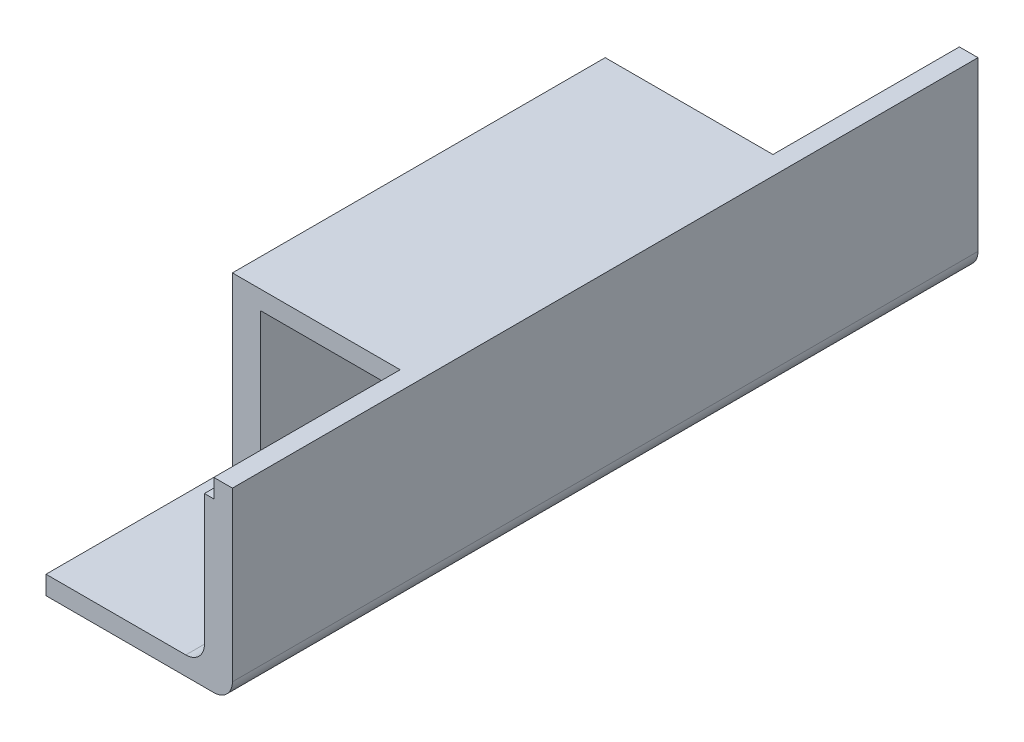
ISO-10303-21;
HEADER;
FILE_DESCRIPTION(('STEP AP214'),'2;1');
FILE_NAME('part.step','',(''),(''),'','','');
FILE_SCHEMA(('AUTOMOTIVE_DESIGN { 1 0 10303 214 1 1 1 1 }'));
ENDSEC;
DATA;
#1=APPLICATION_CONTEXT('core data for automotive mechanical design processes');
#2=APPLICATION_PROTOCOL_DEFINITION('international standard','automotive_design',2000,#1);
#3=PRODUCT_CONTEXT('',#1,'mechanical');
#4=PRODUCT('Part','Part','',(#3));
#5=PRODUCT_RELATED_PRODUCT_CATEGORY('part','',(#4));
#6=PRODUCT_DEFINITION_FORMATION('','',#4);
#7=PRODUCT_DEFINITION_CONTEXT('part definition',#1,'design');
#8=PRODUCT_DEFINITION('design','',#6,#7);
#9=PRODUCT_DEFINITION_SHAPE('','',#8);
#10=(LENGTH_UNIT() NAMED_UNIT(*) SI_UNIT(.MILLI.,.METRE.));
#11=(NAMED_UNIT(*) PLANE_ANGLE_UNIT() SI_UNIT($,.RADIAN.));
#12=(NAMED_UNIT(*) SI_UNIT($,.STERADIAN.) SOLID_ANGLE_UNIT());
#13=UNCERTAINTY_MEASURE_WITH_UNIT(LENGTH_MEASURE(1.E-05),#10,'distance_accuracy_value','');
#14=(GEOMETRIC_REPRESENTATION_CONTEXT(3) GLOBAL_UNCERTAINTY_ASSIGNED_CONTEXT((#13)) GLOBAL_UNIT_ASSIGNED_CONTEXT((#10,
#11,#12)) REPRESENTATION_CONTEXT('',''));
#15=CARTESIAN_POINT('',(0.,0.,0.));
#16=DIRECTION('',(0.,0.,1.));
#17=DIRECTION('',(1.,0.,0.));
#18=AXIS2_PLACEMENT_3D('',#15,#16,#17);
#19=CARTESIAN_POINT('',(0.,2.,0.));
#20=DIRECTION('',(0.,1.,0.));
#21=DIRECTION('',(0.,0.,1.));
#22=AXIS2_PLACEMENT_3D('',#19,#20,#21);
#23=PLANE('',#22);
#24=CARTESIAN_POINT('',(0.,2.,-30.));
#25=DIRECTION('',(0.,1.,0.));
#26=DIRECTION('',(0.,0.,1.));
#27=AXIS2_PLACEMENT_3D('',#24,#25,#26);
#28=CIRCLE('',#27,2.1);
#29=CARTESIAN_POINT('',(0.,2.,-27.9));
#30=VERTEX_POINT('',#29);
#31=EDGE_CURVE('E225',#30,#30,#28,.T.);
#32=ORIENTED_EDGE('',*,*,#31,.F.);
#33=EDGE_LOOP('',(#32));
#34=FACE_BOUND('',#33,.T.);
#35=CARTESIAN_POINT('',(0.,2.,30.));
#36=DIRECTION('',(0.,1.,0.));
#37=DIRECTION('',(0.,0.,1.));
#38=AXIS2_PLACEMENT_3D('',#35,#36,#37);
#39=CIRCLE('',#38,2.1);
#40=CARTESIAN_POINT('',(0.,2.,32.1));
#41=VERTEX_POINT('',#40);
#42=EDGE_CURVE('E228',#41,#41,#39,.T.);
#43=ORIENTED_EDGE('',*,*,#42,.F.);
#44=EDGE_LOOP('',(#43));
#45=FACE_BOUND('',#44,.T.);
#46=DIRECTION('',(0.,0.,-1.));
#47=VECTOR('',#46,1.);
#48=CARTESIAN_POINT('',(-6.99999999999999,2.,-20.));
#49=LINE('',#48,#47);
#50=CARTESIAN_POINT('',(-6.99999999999998,2.,20.));
#51=VERTEX_POINT('',#50);
#52=CARTESIAN_POINT('',(-6.99999999999999,2.,-20.));
#53=VERTEX_POINT('',#52);
#54=EDGE_CURVE('E177',#51,#53,#49,.T.);
#55=ORIENTED_EDGE('',*,*,#54,.F.);
#56=DIRECTION('',(1.,0.,0.));
#57=VECTOR('',#56,1.);
#58=CARTESIAN_POINT('',(-9.99999999999999,2.,20.));
#59=LINE('',#58,#57);
#60=CARTESIAN_POINT('',(-9.99999999999999,2.,20.));
#61=VERTEX_POINT('',#60);
#62=EDGE_CURVE('E321',#61,#51,#59,.T.);
#63=ORIENTED_EDGE('',*,*,#62,.F.);
#64=DIRECTION('',(0.,0.,1.));
#65=VECTOR('',#64,1.);
#66=CARTESIAN_POINT('',(-10.,2.,40.));
#67=LINE('',#66,#65);
#68=CARTESIAN_POINT('',(-10.,2.,40.));
#69=VERTEX_POINT('',#68);
#70=EDGE_CURVE('E258',#61,#69,#67,.T.);
#71=ORIENTED_EDGE('',*,*,#70,.T.);
#72=DIRECTION('',(1.,0.,0.));
#73=VECTOR('',#72,1.);
#74=CARTESIAN_POINT('',(10.,2.,40.));
#75=LINE('',#74,#73);
#76=CARTESIAN_POINT('',(5.00000000000001,2.,40.));
#77=VERTEX_POINT('',#76);
#78=EDGE_CURVE('E257',#69,#77,#75,.T.);
#79=ORIENTED_EDGE('',*,*,#78,.T.);
#80=DIRECTION('',(0.,0.,1.));
#81=VECTOR('',#80,1.);
#82=CARTESIAN_POINT('',(5.00000000000001,2.,0.));
#83=LINE('',#82,#81);
#84=CARTESIAN_POINT('',(5.,2.,-40.));
#85=VERTEX_POINT('',#84);
#86=EDGE_CURVE('E294',#77,#85,#83,.F.);
#87=ORIENTED_EDGE('',*,*,#86,.T.);
#88=DIRECTION('',(-1.,0.,0.));
#89=VECTOR('',#88,1.);
#90=CARTESIAN_POINT('',(10.,2.,-40.));
#91=LINE('',#90,#89);
#92=CARTESIAN_POINT('',(-10.,2.,-40.));
#93=VERTEX_POINT('',#92);
#94=EDGE_CURVE('E261',#85,#93,#91,.T.);
#95=ORIENTED_EDGE('',*,*,#94,.T.);
#96=CARTESIAN_POINT('',(-9.99999999999999,2.,-20.));
#97=VERTEX_POINT('',#96);
#98=EDGE_CURVE('E254',#93,#97,#67,.T.);
#99=ORIENTED_EDGE('',*,*,#98,.T.);
#100=DIRECTION('',(-1.,0.,0.));
#101=VECTOR('',#100,1.);
#102=CARTESIAN_POINT('',(-9.99999999999999,2.,-20.));
#103=LINE('',#102,#101);
#104=EDGE_CURVE('E173',#53,#97,#103,.T.);
#105=ORIENTED_EDGE('',*,*,#104,.F.);
#106=EDGE_LOOP('',(#55,#63,#71,#79,#87,#95,#99,#105));
#107=FACE_BOUND('',#106,.T.);
#108=ADVANCED_FACE('F43',(#34,#45,#107),#23,.T.);
#109=CARTESIAN_POINT('',(0.,18.,0.));
#110=DIRECTION('',(0.,-1.,0.));
#111=DIRECTION('',(0.,0.,-1.));
#112=AXIS2_PLACEMENT_3D('',#109,#110,#111);
#113=PLANE('',#112);
#114=DIRECTION('',(1.,0.,0.));
#115=VECTOR('',#114,1.);
#116=CARTESIAN_POINT('',(0.,18.,20.));
#117=LINE('',#116,#115);
#118=CARTESIAN_POINT('',(-6.99999999999998,18.,20.));
#119=VERTEX_POINT('',#118);
#120=CARTESIAN_POINT('',(7.00000000000001,18.,20.));
#121=VERTEX_POINT('',#120);
#122=EDGE_CURVE('E11',#119,#121,#117,.T.);
#123=ORIENTED_EDGE('',*,*,#122,.F.);
#124=DIRECTION('',(0.,0.,-1.));
#125=VECTOR('',#124,1.);
#126=CARTESIAN_POINT('',(-6.99999999999999,18.,-20.));
#127=LINE('',#126,#125);
#128=CARTESIAN_POINT('',(-6.99999999999999,18.,-20.));
#129=VERTEX_POINT('',#128);
#130=EDGE_CURVE('E169',#119,#129,#127,.T.);
#131=ORIENTED_EDGE('',*,*,#130,.T.);
#132=DIRECTION('',(1.,0.,0.));
#133=VECTOR('',#132,1.);
#134=CARTESIAN_POINT('',(-9.99999999999999,18.,-20.));
#135=LINE('',#134,#133);
#136=CARTESIAN_POINT('',(7.,18.,-20.));
#137=VERTEX_POINT('',#136);
#138=EDGE_CURVE('E160',#129,#137,#135,.T.);
#139=ORIENTED_EDGE('',*,*,#138,.T.);
#140=DIRECTION('',(0.,0.,1.));
#141=VECTOR('',#140,1.);
#142=CARTESIAN_POINT('',(7.,18.,-40.));
#143=LINE('',#142,#141);
#144=EDGE_CURVE('E247',#137,#121,#143,.T.);
#145=ORIENTED_EDGE('',*,*,#144,.T.);
#146=EDGE_LOOP('',(#123,#131,#139,#145));
#147=FACE_BOUND('',#146,.T.);
#148=ADVANCED_FACE('F170',(#147),#113,.T.);
#149=CARTESIAN_POINT('',(-10.,2.,40.));
#150=DIRECTION('',(1.,0.,0.));
#151=DIRECTION('',(0.,0.,-1.));
#152=AXIS2_PLACEMENT_3D('',#149,#150,#151);
#153=PLANE('',#152);
#154=DIRECTION('',(0.,0.,1.));
#155=VECTOR('',#154,1.);
#156=CARTESIAN_POINT('',(-10.,0.,40.));
#157=LINE('',#156,#155);
#158=CARTESIAN_POINT('',(-10.,0.,-40.));
#159=VERTEX_POINT('',#158);
#160=CARTESIAN_POINT('',(-10.,0.,40.));
#161=VERTEX_POINT('',#160);
#162=EDGE_CURVE('E253',#159,#161,#157,.T.);
#163=ORIENTED_EDGE('',*,*,#162,.T.);
#164=DIRECTION('',(0.,-1.,0.));
#165=VECTOR('',#164,1.);
#166=CARTESIAN_POINT('',(-10.,2.,40.));
#167=LINE('',#166,#165);
#168=EDGE_CURVE('E279',#69,#161,#167,.T.);
#169=ORIENTED_EDGE('',*,*,#168,.F.);
#170=ORIENTED_EDGE('',*,*,#70,.F.);
#171=DIRECTION('',(0.,1.,0.));
#172=VECTOR('',#171,1.);
#173=CARTESIAN_POINT('',(-9.99999999999999,18.,20.));
#174=LINE('',#173,#172);
#175=CARTESIAN_POINT('',(-9.99999999999999,20.,20.));
#176=VERTEX_POINT('',#175);
#177=EDGE_CURVE('E181',#61,#176,#174,.T.);
#178=ORIENTED_EDGE('',*,*,#177,.T.);
#179=DIRECTION('',(0.,0.,1.));
#180=VECTOR('',#179,1.);
#181=CARTESIAN_POINT('',(-9.99999999999999,20.,-40.));
#182=LINE('',#181,#180);
#183=CARTESIAN_POINT('',(-9.99999999999999,20.,-20.));
#184=VERTEX_POINT('',#183);
#185=EDGE_CURVE('E238',#184,#176,#182,.T.);
#186=ORIENTED_EDGE('',*,*,#185,.F.);
#187=DIRECTION('',(0.,1.,0.));
#188=VECTOR('',#187,1.);
#189=CARTESIAN_POINT('',(-9.99999999999999,18.,-20.));
#190=LINE('',#189,#188);
#191=EDGE_CURVE('E190',#97,#184,#190,.T.);
#192=ORIENTED_EDGE('',*,*,#191,.F.);
#193=ORIENTED_EDGE('',*,*,#98,.F.);
#194=DIRECTION('',(0.,-1.,0.));
#195=VECTOR('',#194,1.);
#196=CARTESIAN_POINT('',(-10.,2.,-40.));
#197=LINE('',#196,#195);
#198=EDGE_CURVE('E263',#93,#159,#197,.T.);
#199=ORIENTED_EDGE('',*,*,#198,.T.);
#200=EDGE_LOOP('',(#163,#169,#170,#178,#186,#192,#193,#199));
#201=FACE_BOUND('',#200,.T.);
#202=ADVANCED_FACE('F323',(#201),#153,.F.);
#203=CARTESIAN_POINT('',(10.,2.,40.));
#204=DIRECTION('',(0.,0.,-1.));
#205=DIRECTION('',(-1.,0.,0.));
#206=AXIS2_PLACEMENT_3D('',#203,#204,#205);
#207=PLANE('',#206);
#208=DIRECTION('',(1.,0.,0.));
#209=VECTOR('',#208,1.);
#210=CARTESIAN_POINT('',(10.,20.,40.));
#211=LINE('',#210,#209);
#212=CARTESIAN_POINT('',(8.,20.,40.));
#213=VERTEX_POINT('',#212);
#214=CARTESIAN_POINT('',(10.,20.,40.));
#215=VERTEX_POINT('',#214);
#216=EDGE_CURVE('E241',#213,#215,#211,.T.);
#217=ORIENTED_EDGE('',*,*,#216,.F.);
#218=DIRECTION('',(0.,1.,0.));
#219=VECTOR('',#218,1.);
#220=CARTESIAN_POINT('',(8.,18.,40.));
#221=LINE('',#220,#219);
#222=CARTESIAN_POINT('',(8.,18.,40.));
#223=VERTEX_POINT('',#222);
#224=EDGE_CURVE('E203',#223,#213,#221,.T.);
#225=ORIENTED_EDGE('',*,*,#224,.F.);
#226=DIRECTION('',(1.,0.,0.));
#227=VECTOR('',#226,1.);
#228=CARTESIAN_POINT('',(-9.99999999999999,18.,40.));
#229=LINE('',#228,#227);
#230=CARTESIAN_POINT('',(7.00000000000001,18.,40.));
#231=VERTEX_POINT('',#230);
#232=EDGE_CURVE('E212',#231,#223,#229,.T.);
#233=ORIENTED_EDGE('',*,*,#232,.F.);
#234=DIRECTION('',(0.,-1.,0.));
#235=VECTOR('',#234,1.);
#236=CARTESIAN_POINT('',(7.00000000000001,18.,40.));
#237=LINE('',#236,#235);
#238=CARTESIAN_POINT('',(7.00000000000001,4.,40.));
#239=VERTEX_POINT('',#238);
#240=EDGE_CURVE('E246',#231,#239,#237,.T.);
#241=ORIENTED_EDGE('',*,*,#240,.T.);
#242=CARTESIAN_POINT('',(5.00000000000001,4.,40.));
#243=DIRECTION('',(0.,0.,-1.));
#244=DIRECTION('',(-1.,0.,0.));
#245=AXIS2_PLACEMENT_3D('',#242,#243,#244);
#246=CIRCLE('',#245,2.);
#247=EDGE_CURVE('E296',#239,#77,#246,.T.);
#248=ORIENTED_EDGE('',*,*,#247,.T.);
#249=ORIENTED_EDGE('',*,*,#78,.F.);
#250=ORIENTED_EDGE('',*,*,#168,.T.);
#251=DIRECTION('',(1.,0.,0.));
#252=VECTOR('',#251,1.);
#253=CARTESIAN_POINT('',(10.,0.,40.));
#254=LINE('',#253,#252);
#255=CARTESIAN_POINT('',(8.,0.,40.));
#256=VERTEX_POINT('',#255);
#257=EDGE_CURVE('E266',#161,#256,#254,.T.);
#258=ORIENTED_EDGE('',*,*,#257,.T.);
#259=CARTESIAN_POINT('',(8.,2.,40.));
#260=DIRECTION('',(0.,0.,-1.));
#261=DIRECTION('',(-1.,0.,0.));
#262=AXIS2_PLACEMENT_3D('',#259,#260,#261);
#263=CIRCLE('',#262,2.);
#264=CARTESIAN_POINT('',(10.,2.,40.));
#265=VERTEX_POINT('',#264);
#266=EDGE_CURVE('E289',#256,#265,#263,.F.);
#267=ORIENTED_EDGE('',*,*,#266,.T.);
#268=DIRECTION('',(0.,-1.,0.));
#269=VECTOR('',#268,1.);
#270=CARTESIAN_POINT('',(10.,2.,40.));
#271=LINE('',#270,#269);
#272=EDGE_CURVE('E276',#215,#265,#271,.T.);
#273=ORIENTED_EDGE('',*,*,#272,.F.);
#274=EDGE_LOOP('',(#217,#225,#233,#241,#248,#249,#250,#258,#267,#273));
#275=FACE_BOUND('',#274,.T.);
#276=ADVANCED_FACE('F315',(#275),#207,.F.);
#277=CARTESIAN_POINT('',(10.,2.,40.));
#278=DIRECTION('',(-1.,0.,0.));
#279=DIRECTION('',(0.,0.,1.));
#280=AXIS2_PLACEMENT_3D('',#277,#278,#279);
#281=PLANE('',#280);
#282=ORIENTED_EDGE('',*,*,#272,.T.);
#283=DIRECTION('',(0.,0.,-1.));
#284=VECTOR('',#283,1.);
#285=CARTESIAN_POINT('',(10.,2.,40.));
#286=LINE('',#285,#284);
#287=CARTESIAN_POINT('',(10.,2.,-40.));
#288=VERTEX_POINT('',#287);
#289=EDGE_CURVE('E282',#265,#288,#286,.T.);
#290=ORIENTED_EDGE('',*,*,#289,.T.);
#291=DIRECTION('',(0.,-1.,0.));
#292=VECTOR('',#291,1.);
#293=CARTESIAN_POINT('',(10.,2.,-40.));
#294=LINE('',#293,#292);
#295=CARTESIAN_POINT('',(10.,20.,-40.));
#296=VERTEX_POINT('',#295);
#297=EDGE_CURVE('E273',#296,#288,#294,.T.);
#298=ORIENTED_EDGE('',*,*,#297,.F.);
#299=DIRECTION('',(0.,0.,-1.));
#300=VECTOR('',#299,1.);
#301=CARTESIAN_POINT('',(10.,20.,-40.));
#302=LINE('',#301,#300);
#303=EDGE_CURVE('E224',#215,#296,#302,.T.);
#304=ORIENTED_EDGE('',*,*,#303,.F.);
#305=EDGE_LOOP('',(#282,#290,#298,#304));
#306=FACE_BOUND('',#305,.T.);
#307=ADVANCED_FACE('F334',(#306),#281,.F.);
#308=CARTESIAN_POINT('',(10.,2.,-40.));
#309=DIRECTION('',(0.,0.,1.));
#310=DIRECTION('',(1.,0.,0.));
#311=AXIS2_PLACEMENT_3D('',#308,#309,#310);
#312=PLANE('',#311);
#313=DIRECTION('',(-1.,0.,0.));
#314=VECTOR('',#313,1.);
#315=CARTESIAN_POINT('',(-9.99999999999999,18.,-40.));
#316=LINE('',#315,#314);
#317=CARTESIAN_POINT('',(8.,18.,-40.));
#318=VERTEX_POINT('',#317);
#319=CARTESIAN_POINT('',(7.00000000000001,18.,-40.));
#320=VERTEX_POINT('',#319);
#321=EDGE_CURVE('E188',#318,#320,#316,.T.);
#322=ORIENTED_EDGE('',*,*,#321,.F.);
#323=DIRECTION('',(0.,1.,0.));
#324=VECTOR('',#323,1.);
#325=CARTESIAN_POINT('',(8.,18.,-40.));
#326=LINE('',#325,#324);
#327=CARTESIAN_POINT('',(8.,20.,-40.));
#328=VERTEX_POINT('',#327);
#329=EDGE_CURVE('E196',#318,#328,#326,.T.);
#330=ORIENTED_EDGE('',*,*,#329,.T.);
#331=DIRECTION('',(-1.,0.,0.));
#332=VECTOR('',#331,1.);
#333=CARTESIAN_POINT('',(10.,20.,-40.));
#334=LINE('',#333,#332);
#335=EDGE_CURVE('E235',#296,#328,#334,.T.);
#336=ORIENTED_EDGE('',*,*,#335,.F.);
#337=ORIENTED_EDGE('',*,*,#297,.T.);
#338=CARTESIAN_POINT('',(8.,2.,-40.));
#339=DIRECTION('',(0.,0.,1.));
#340=DIRECTION('',(1.,0.,0.));
#341=AXIS2_PLACEMENT_3D('',#338,#339,#340);
#342=CIRCLE('',#341,2.);
#343=CARTESIAN_POINT('',(8.,0.,-40.));
#344=VERTEX_POINT('',#343);
#345=EDGE_CURVE('E285',#288,#344,#342,.F.);
#346=ORIENTED_EDGE('',*,*,#345,.T.);
#347=DIRECTION('',(-1.,0.,0.));
#348=VECTOR('',#347,1.);
#349=CARTESIAN_POINT('',(10.,0.,-40.));
#350=LINE('',#349,#348);
#351=EDGE_CURVE('E269',#344,#159,#350,.T.);
#352=ORIENTED_EDGE('',*,*,#351,.T.);
#353=ORIENTED_EDGE('',*,*,#198,.F.);
#354=ORIENTED_EDGE('',*,*,#94,.F.);
#355=CARTESIAN_POINT('',(5.,4.,-40.));
#356=DIRECTION('',(0.,0.,1.));
#357=DIRECTION('',(1.,0.,0.));
#358=AXIS2_PLACEMENT_3D('',#355,#356,#357);
#359=CIRCLE('',#358,2.);
#360=CARTESIAN_POINT('',(7.,4.,-40.));
#361=VERTEX_POINT('',#360);
#362=EDGE_CURVE('E51',#85,#361,#359,.T.);
#363=ORIENTED_EDGE('',*,*,#362,.T.);
#364=DIRECTION('',(0.,-1.,0.));
#365=VECTOR('',#364,1.);
#366=CARTESIAN_POINT('',(7.,18.,-40.));
#367=LINE('',#366,#365);
#368=EDGE_CURVE('E250',#320,#361,#367,.T.);
#369=ORIENTED_EDGE('',*,*,#368,.F.);
#370=EDGE_LOOP('',(#322,#330,#336,#337,#346,#352,#353,#354,#363,#369));
#371=FACE_BOUND('',#370,.T.);
#372=ADVANCED_FACE('F302',(#371),#312,.F.);
#373=CARTESIAN_POINT('',(0.,0.,0.));
#374=DIRECTION('',(0.,1.,0.));
#375=DIRECTION('',(0.,0.,1.));
#376=AXIS2_PLACEMENT_3D('',#373,#374,#375);
#377=PLANE('',#376);
#378=CARTESIAN_POINT('',(0.,0.,-30.));
#379=DIRECTION('',(0.,1.,0.));
#380=DIRECTION('',(0.,0.,1.));
#381=AXIS2_PLACEMENT_3D('',#378,#379,#380);
#382=CIRCLE('',#381,2.1);
#383=CARTESIAN_POINT('',(0.,0.,-27.9));
#384=VERTEX_POINT('',#383);
#385=EDGE_CURVE('E221',#384,#384,#382,.T.);
#386=ORIENTED_EDGE('',*,*,#385,.T.);
#387=EDGE_LOOP('',(#386));
#388=FACE_BOUND('',#387,.T.);
#389=CARTESIAN_POINT('',(0.,0.,30.));
#390=DIRECTION('',(0.,1.,0.));
#391=DIRECTION('',(0.,0.,1.));
#392=AXIS2_PLACEMENT_3D('',#389,#390,#391);
#393=CIRCLE('',#392,2.1);
#394=CARTESIAN_POINT('',(0.,0.,32.1));
#395=VERTEX_POINT('',#394);
#396=EDGE_CURVE('E199',#395,#395,#393,.T.);
#397=ORIENTED_EDGE('',*,*,#396,.T.);
#398=EDGE_LOOP('',(#397));
#399=FACE_BOUND('',#398,.T.);
#400=ORIENTED_EDGE('',*,*,#351,.F.);
#401=DIRECTION('',(0.,0.,-1.));
#402=VECTOR('',#401,1.);
#403=CARTESIAN_POINT('',(8.,0.,0.));
#404=LINE('',#403,#402);
#405=EDGE_CURVE('E287',#344,#256,#404,.F.);
#406=ORIENTED_EDGE('',*,*,#405,.T.);
#407=ORIENTED_EDGE('',*,*,#257,.F.);
#408=ORIENTED_EDGE('',*,*,#162,.F.);
#409=EDGE_LOOP('',(#400,#406,#407,#408));
#410=FACE_BOUND('',#409,.T.);
#411=ADVANCED_FACE('F381',(#388,#399,#410),#377,.F.);
#412=CARTESIAN_POINT('',(7.,18.,-40.));
#413=DIRECTION('',(1.,0.,0.));
#414=DIRECTION('',(0.,0.,-1.));
#415=AXIS2_PLACEMENT_3D('',#412,#413,#414);
#416=PLANE('',#415);
#417=ORIENTED_EDGE('',*,*,#368,.T.);
#418=DIRECTION('',(0.,0.,1.));
#419=VECTOR('',#418,1.);
#420=CARTESIAN_POINT('',(7.,4.,-40.));
#421=LINE('',#420,#419);
#422=EDGE_CURVE('E291',#361,#239,#421,.T.);
#423=ORIENTED_EDGE('',*,*,#422,.T.);
#424=ORIENTED_EDGE('',*,*,#240,.F.);
#425=EDGE_CURVE('E243',#121,#231,#143,.T.);
#426=ORIENTED_EDGE('',*,*,#425,.F.);
#427=ORIENTED_EDGE('',*,*,#144,.F.);
#428=EDGE_CURVE('E244',#320,#137,#143,.T.);
#429=ORIENTED_EDGE('',*,*,#428,.F.);
#430=EDGE_LOOP('',(#417,#423,#424,#426,#427,#429));
#431=FACE_BOUND('',#430,.T.);
#432=ADVANCED_FACE('F309',(#431),#416,.F.);
#433=CARTESIAN_POINT('',(8.,2.,40.));
#434=DIRECTION('',(0.,0.,-1.));
#435=DIRECTION('',(-1.,0.,0.));
#436=AXIS2_PLACEMENT_3D('',#433,#434,#435);
#437=CYLINDRICAL_SURFACE('',#436,2.);
#438=ORIENTED_EDGE('',*,*,#266,.F.);
#439=ORIENTED_EDGE('',*,*,#405,.F.);
#440=ORIENTED_EDGE('',*,*,#345,.F.);
#441=ORIENTED_EDGE('',*,*,#289,.F.);
#442=EDGE_LOOP('',(#438,#439,#440,#441));
#443=FACE_BOUND('',#442,.T.);
#444=ADVANCED_FACE('F332',(#443),#437,.T.);
#445=CARTESIAN_POINT('',(5.,4.,-40.));
#446=DIRECTION('',(0.,0.,1.));
#447=DIRECTION('',(1.,0.,0.));
#448=AXIS2_PLACEMENT_3D('',#445,#446,#447);
#449=CYLINDRICAL_SURFACE('',#448,2.);
#450=ORIENTED_EDGE('',*,*,#362,.F.);
#451=ORIENTED_EDGE('',*,*,#86,.F.);
#452=ORIENTED_EDGE('',*,*,#247,.F.);
#453=ORIENTED_EDGE('',*,*,#422,.F.);
#454=EDGE_LOOP('',(#450,#451,#452,#453));
#455=FACE_BOUND('',#454,.T.);
#456=ADVANCED_FACE('F45',(#455),#449,.F.);
#457=CARTESIAN_POINT('',(0.,20.,0.));
#458=DIRECTION('',(0.,-1.,0.));
#459=DIRECTION('',(0.,0.,-1.));
#460=AXIS2_PLACEMENT_3D('',#457,#458,#459);
#461=PLANE('',#460);
#462=ORIENTED_EDGE('',*,*,#335,.T.);
#463=DIRECTION('',(0.,0.,-1.));
#464=VECTOR('',#463,1.);
#465=CARTESIAN_POINT('',(8.,20.,-40.));
#466=LINE('',#465,#464);
#467=CARTESIAN_POINT('',(8.,20.,-20.));
#468=VERTEX_POINT('',#467);
#469=EDGE_CURVE('E193',#468,#328,#466,.T.);
#470=ORIENTED_EDGE('',*,*,#469,.F.);
#471=DIRECTION('',(1.,0.,0.));
#472=VECTOR('',#471,1.);
#473=CARTESIAN_POINT('',(-9.99999999999999,20.,-20.));
#474=LINE('',#473,#472);
#475=EDGE_CURVE('E191',#184,#468,#474,.T.);
#476=ORIENTED_EDGE('',*,*,#475,.F.);
#477=ORIENTED_EDGE('',*,*,#185,.T.);
#478=DIRECTION('',(-1.,0.,0.));
#479=VECTOR('',#478,1.);
#480=CARTESIAN_POINT('',(-9.99999999999999,20.,20.));
#481=LINE('',#480,#479);
#482=CARTESIAN_POINT('',(8.,20.,20.));
#483=VERTEX_POINT('',#482);
#484=EDGE_CURVE('E210',#483,#176,#481,.T.);
#485=ORIENTED_EDGE('',*,*,#484,.F.);
#486=DIRECTION('',(0.,0.,-1.));
#487=VECTOR('',#486,1.);
#488=CARTESIAN_POINT('',(8.,20.,40.));
#489=LINE('',#488,#487);
#490=EDGE_CURVE('E194',#213,#483,#489,.T.);
#491=ORIENTED_EDGE('',*,*,#490,.F.);
#492=ORIENTED_EDGE('',*,*,#216,.T.);
#493=ORIENTED_EDGE('',*,*,#303,.T.);
#494=EDGE_LOOP('',(#462,#470,#476,#477,#485,#491,#492,#493));
#495=FACE_BOUND('',#494,.T.);
#496=ADVANCED_FACE('F340',(#495),#461,.F.);
#497=CARTESIAN_POINT('',(0.,0.,30.));
#498=DIRECTION('',(0.,1.,0.));
#499=DIRECTION('',(0.,0.,1.));
#500=AXIS2_PLACEMENT_3D('',#497,#498,#499);
#501=CYLINDRICAL_SURFACE('',#500,2.1);
#502=ORIENTED_EDGE('',*,*,#396,.F.);
#503=EDGE_LOOP('',(#502));
#504=FACE_BOUND('',#503,.T.);
#505=ORIENTED_EDGE('',*,*,#42,.T.);
#506=EDGE_LOOP('',(#505));
#507=FACE_BOUND('',#506,.T.);
#508=ADVANCED_FACE('F409',(#504,#507),#501,.F.);
#509=CARTESIAN_POINT('',(0.,0.,-30.));
#510=DIRECTION('',(0.,1.,0.));
#511=DIRECTION('',(0.,0.,1.));
#512=AXIS2_PLACEMENT_3D('',#509,#510,#511);
#513=CYLINDRICAL_SURFACE('',#512,2.1);
#514=ORIENTED_EDGE('',*,*,#385,.F.);
#515=EDGE_LOOP('',(#514));
#516=FACE_BOUND('',#515,.T.);
#517=ORIENTED_EDGE('',*,*,#31,.T.);
#518=EDGE_LOOP('',(#517));
#519=FACE_BOUND('',#518,.T.);
#520=ADVANCED_FACE('F417',(#516,#519),#513,.F.);
#521=CARTESIAN_POINT('',(0.,18.,0.));
#522=DIRECTION('',(0.,-1.,0.));
#523=DIRECTION('',(0.,0.,-1.));
#524=AXIS2_PLACEMENT_3D('',#521,#522,#523);
#525=PLANE('',#524);
#526=ORIENTED_EDGE('',*,*,#232,.T.);
#527=DIRECTION('',(0.,0.,-1.));
#528=VECTOR('',#527,1.);
#529=CARTESIAN_POINT('',(8.,18.,40.));
#530=LINE('',#529,#528);
#531=CARTESIAN_POINT('',(8.,18.,20.));
#532=VERTEX_POINT('',#531);
#533=EDGE_CURVE('E217',#223,#532,#530,.T.);
#534=ORIENTED_EDGE('',*,*,#533,.T.);
#535=DIRECTION('',(-1.,0.,0.));
#536=VECTOR('',#535,1.);
#537=CARTESIAN_POINT('',(-9.99999999999999,18.,20.));
#538=LINE('',#537,#536);
#539=EDGE_CURVE('E205',#532,#121,#538,.T.);
#540=ORIENTED_EDGE('',*,*,#539,.T.);
#541=ORIENTED_EDGE('',*,*,#425,.T.);
#542=EDGE_LOOP('',(#526,#534,#540,#541));
#543=FACE_BOUND('',#542,.T.);
#544=ADVANCED_FACE('F349',(#543),#525,.F.);
#545=CARTESIAN_POINT('',(-9.99999999999999,18.,20.));
#546=DIRECTION('',(0.,0.,-1.));
#547=DIRECTION('',(-1.,0.,0.));
#548=AXIS2_PLACEMENT_3D('',#545,#546,#547);
#549=PLANE('',#548);
#550=ORIENTED_EDGE('',*,*,#484,.T.);
#551=ORIENTED_EDGE('',*,*,#177,.F.);
#552=ORIENTED_EDGE('',*,*,#62,.T.);
#553=DIRECTION('',(0.,-1.,0.));
#554=VECTOR('',#553,1.);
#555=CARTESIAN_POINT('',(-6.99999999999998,18.,20.));
#556=LINE('',#555,#554);
#557=EDGE_CURVE('E179',#119,#51,#556,.T.);
#558=ORIENTED_EDGE('',*,*,#557,.F.);
#559=ORIENTED_EDGE('',*,*,#122,.T.);
#560=ORIENTED_EDGE('',*,*,#539,.F.);
#561=DIRECTION('',(0.,1.,0.));
#562=VECTOR('',#561,1.);
#563=CARTESIAN_POINT('',(8.,18.,20.));
#564=LINE('',#563,#562);
#565=EDGE_CURVE('E206',#532,#483,#564,.T.);
#566=ORIENTED_EDGE('',*,*,#565,.T.);
#567=EDGE_LOOP('',(#550,#551,#552,#558,#559,#560,#566));
#568=FACE_BOUND('',#567,.T.);
#569=ADVANCED_FACE('F352',(#568),#549,.F.);
#570=CARTESIAN_POINT('',(8.,18.,40.));
#571=DIRECTION('',(1.,0.,0.));
#572=DIRECTION('',(0.,0.,-1.));
#573=AXIS2_PLACEMENT_3D('',#570,#571,#572);
#574=PLANE('',#573);
#575=ORIENTED_EDGE('',*,*,#490,.T.);
#576=ORIENTED_EDGE('',*,*,#565,.F.);
#577=ORIENTED_EDGE('',*,*,#533,.F.);
#578=ORIENTED_EDGE('',*,*,#224,.T.);
#579=EDGE_LOOP('',(#575,#576,#577,#578));
#580=FACE_BOUND('',#579,.T.);
#581=ADVANCED_FACE('F346',(#580),#574,.F.);
#582=CARTESIAN_POINT('',(0.,18.,0.));
#583=DIRECTION('',(0.,1.,0.));
#584=DIRECTION('',(0.,0.,1.));
#585=AXIS2_PLACEMENT_3D('',#582,#583,#584);
#586=PLANE('',#585);
#587=ORIENTED_EDGE('',*,*,#428,.T.);
#588=CARTESIAN_POINT('',(8.,18.,-20.));
#589=VERTEX_POINT('',#588);
#590=EDGE_CURVE('E164',#137,#589,#135,.T.);
#591=ORIENTED_EDGE('',*,*,#590,.T.);
#592=DIRECTION('',(0.,0.,-1.));
#593=VECTOR('',#592,1.);
#594=CARTESIAN_POINT('',(8.,18.,-40.));
#595=LINE('',#594,#593);
#596=EDGE_CURVE('E166',#589,#318,#595,.T.);
#597=ORIENTED_EDGE('',*,*,#596,.T.);
#598=ORIENTED_EDGE('',*,*,#321,.T.);
#599=EDGE_LOOP('',(#587,#591,#597,#598));
#600=FACE_BOUND('',#599,.T.);
#601=ADVANCED_FACE('F360',(#600),#586,.T.);
#602=CARTESIAN_POINT('',(8.,18.,-40.));
#603=DIRECTION('',(1.,0.,0.));
#604=DIRECTION('',(0.,0.,-1.));
#605=AXIS2_PLACEMENT_3D('',#602,#603,#604);
#606=PLANE('',#605);
#607=ORIENTED_EDGE('',*,*,#469,.T.);
#608=ORIENTED_EDGE('',*,*,#329,.F.);
#609=ORIENTED_EDGE('',*,*,#596,.F.);
#610=DIRECTION('',(0.,1.,0.));
#611=VECTOR('',#610,1.);
#612=CARTESIAN_POINT('',(8.,18.,-20.));
#613=LINE('',#612,#611);
#614=EDGE_CURVE('E200',#589,#468,#613,.T.);
#615=ORIENTED_EDGE('',*,*,#614,.T.);
#616=EDGE_LOOP('',(#607,#608,#609,#615));
#617=FACE_BOUND('',#616,.T.);
#618=ADVANCED_FACE('F358',(#617),#606,.F.);
#619=CARTESIAN_POINT('',(-9.99999999999999,18.,-20.));
#620=DIRECTION('',(0.,0.,1.));
#621=DIRECTION('',(1.,0.,0.));
#622=AXIS2_PLACEMENT_3D('',#619,#620,#621);
#623=PLANE('',#622);
#624=ORIENTED_EDGE('',*,*,#475,.T.);
#625=ORIENTED_EDGE('',*,*,#614,.F.);
#626=ORIENTED_EDGE('',*,*,#590,.F.);
#627=ORIENTED_EDGE('',*,*,#138,.F.);
#628=DIRECTION('',(0.,-1.,0.));
#629=VECTOR('',#628,1.);
#630=CARTESIAN_POINT('',(-6.99999999999999,18.,-20.));
#631=LINE('',#630,#629);
#632=EDGE_CURVE('E58',#129,#53,#631,.T.);
#633=ORIENTED_EDGE('',*,*,#632,.T.);
#634=ORIENTED_EDGE('',*,*,#104,.T.);
#635=ORIENTED_EDGE('',*,*,#191,.T.);
#636=EDGE_LOOP('',(#624,#625,#626,#627,#633,#634,#635));
#637=FACE_BOUND('',#636,.T.);
#638=ADVANCED_FACE('F162',(#637),#623,.F.);
#639=CARTESIAN_POINT('',(-6.99999999999999,18.,-20.));
#640=DIRECTION('',(-1.,0.,0.));
#641=DIRECTION('',(0.,0.,1.));
#642=AXIS2_PLACEMENT_3D('',#639,#640,#641);
#643=PLANE('',#642);
#644=ORIENTED_EDGE('',*,*,#54,.T.);
#645=ORIENTED_EDGE('',*,*,#632,.F.);
#646=ORIENTED_EDGE('',*,*,#130,.F.);
#647=ORIENTED_EDGE('',*,*,#557,.T.);
#648=EDGE_LOOP('',(#644,#645,#646,#647));
#649=FACE_BOUND('',#648,.T.);
#650=ADVANCED_FACE('F175',(#649),#643,.F.);
#651=CLOSED_SHELL('',(#108,#148,#202,#276,#307,#372,#411,#432,#444,#456,#496,#508,#520,#544,
#569,#581,#601,#618,#638,#650));
#652=MANIFOLD_SOLID_BREP('B2',#651);
#653=ADVANCED_BREP_SHAPE_REPRESENTATION('',(#18,#652),#14);
#654=SHAPE_DEFINITION_REPRESENTATION(#9,#653);
ENDSEC;
END-ISO-10303-21;
